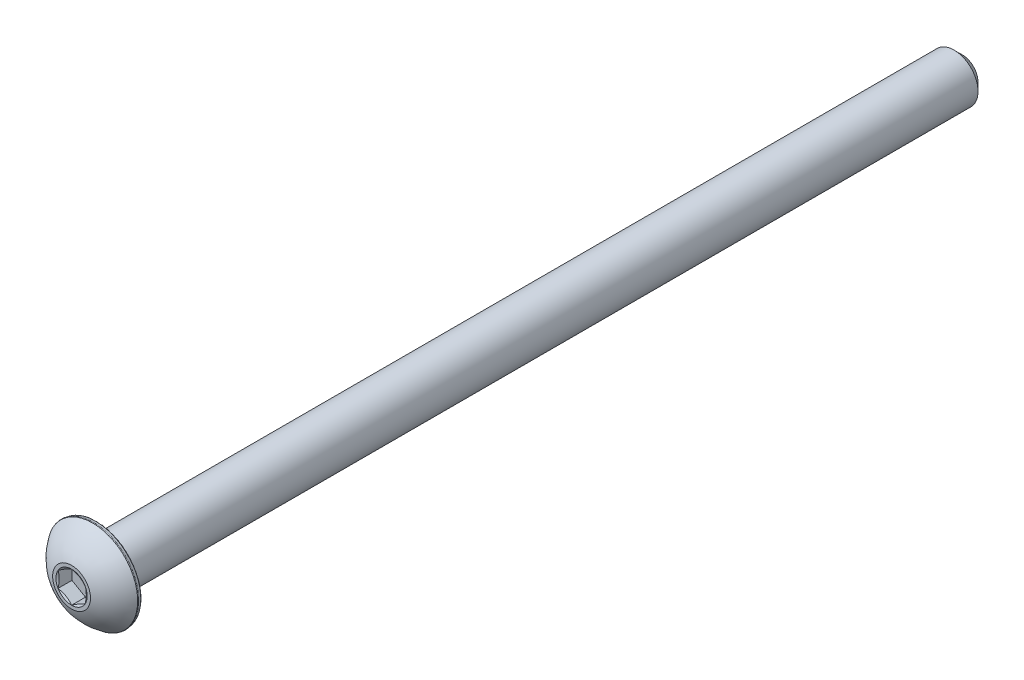
ISO-10303-21;
HEADER;
FILE_DESCRIPTION(('STEP AP214'),'2;1');
FILE_NAME('part.step','',(''),(''),'','','');
FILE_SCHEMA(('AUTOMOTIVE_DESIGN { 1 0 10303 214 1 1 1 1 }'));
ENDSEC;
DATA;
#1=APPLICATION_CONTEXT('core data for automotive mechanical design processes');
#2=APPLICATION_PROTOCOL_DEFINITION('international standard','automotive_design',2000,#1);
#3=PRODUCT_CONTEXT('',#1,'mechanical');
#4=PRODUCT('Part','Part','',(#3));
#5=PRODUCT_RELATED_PRODUCT_CATEGORY('part','',(#4));
#6=PRODUCT_DEFINITION_FORMATION('','',#4);
#7=PRODUCT_DEFINITION_CONTEXT('part definition',#1,'design');
#8=PRODUCT_DEFINITION('design','',#6,#7);
#9=PRODUCT_DEFINITION_SHAPE('','',#8);
#10=(LENGTH_UNIT() NAMED_UNIT(*) SI_UNIT(.MILLI.,.METRE.));
#11=(NAMED_UNIT(*) PLANE_ANGLE_UNIT() SI_UNIT($,.RADIAN.));
#12=(NAMED_UNIT(*) SI_UNIT($,.STERADIAN.) SOLID_ANGLE_UNIT());
#13=UNCERTAINTY_MEASURE_WITH_UNIT(LENGTH_MEASURE(1.E-05),#10,'distance_accuracy_value','');
#14=(GEOMETRIC_REPRESENTATION_CONTEXT(3) GLOBAL_UNCERTAINTY_ASSIGNED_CONTEXT((#13)) GLOBAL_UNIT_ASSIGNED_CONTEXT((#10,
#11,#12)) REPRESENTATION_CONTEXT('',''));
#15=CARTESIAN_POINT('',(0.,0.,0.));
#16=DIRECTION('',(0.,0.,1.));
#17=DIRECTION('',(1.,0.,0.));
#18=AXIS2_PLACEMENT_3D('',#15,#16,#17);
#19=CARTESIAN_POINT('',(0.,0.,32.6771));
#20=DIRECTION('',(0.,0.,-1.));
#21=DIRECTION('',(-1.,0.,0.));
#22=AXIS2_PLACEMENT_3D('',#19,#20,#21);
#23=PLANE('',#22);
#24=CARTESIAN_POINT('',(0.,0.,32.6771));
#25=DIRECTION('',(0.,0.,1.));
#26=DIRECTION('',(1.,0.,0.));
#27=AXIS2_PLACEMENT_3D('',#24,#25,#26);
#28=CIRCLE('',#27,1.14567944042316);
#29=CARTESIAN_POINT('',(-0.9921875,0.572839720211583,32.6771));
#30=VERTEX_POINT('',#29);
#31=CARTESIAN_POINT('',(-0.992187500000003,-0.572839720211579,32.6771));
#32=VERTEX_POINT('',#31);
#33=EDGE_CURVE('E98',#30,#32,#28,.T.);
#34=ORIENTED_EDGE('',*,*,#33,.F.);
#35=CARTESIAN_POINT('',(0.,1.14567944042316,32.6771));
#36=VERTEX_POINT('',#35);
#37=EDGE_CURVE('E108',#36,#30,#28,.T.);
#38=ORIENTED_EDGE('',*,*,#37,.F.);
#39=CARTESIAN_POINT('',(0.9921875,0.572839720211584,32.6771));
#40=VERTEX_POINT('',#39);
#41=EDGE_CURVE('E58',#40,#36,#28,.T.);
#42=ORIENTED_EDGE('',*,*,#41,.F.);
#43=CARTESIAN_POINT('',(0.992187500000003,-0.572839720211579,32.6771));
#44=VERTEX_POINT('',#43);
#45=EDGE_CURVE('E65',#44,#40,#28,.T.);
#46=ORIENTED_EDGE('',*,*,#45,.F.);
#47=CARTESIAN_POINT('',(0.,-1.14567944042317,32.6771));
#48=VERTEX_POINT('',#47);
#49=EDGE_CURVE('E144',#48,#44,#28,.T.);
#50=ORIENTED_EDGE('',*,*,#49,.F.);
#51=EDGE_CURVE('E109',#32,#48,#28,.T.);
#52=ORIENTED_EDGE('',*,*,#51,.F.);
#53=EDGE_LOOP('',(#34,#38,#42,#46,#50,#52));
#54=FACE_BOUND('',#53,.T.);
#55=CARTESIAN_POINT('',(0.,0.,32.6771));
#56=DIRECTION('',(0.,0.,1.));
#57=DIRECTION('',(1.,0.,0.));
#58=AXIS2_PLACEMENT_3D('',#55,#56,#57);
#59=CIRCLE('',#58,1.3890625);
#60=CARTESIAN_POINT('',(0.,1.38906250000001,32.6771));
#61=VERTEX_POINT('',#60);
#62=EDGE_CURVE('E121',#61,#61,#59,.T.);
#63=ORIENTED_EDGE('',*,*,#62,.T.);
#64=EDGE_LOOP('',(#63));
#65=FACE_BOUND('',#64,.T.);
#66=ADVANCED_FACE('F43',(#54,#65),#23,.F.);
#67=CARTESIAN_POINT('',(0.,0.,28.9887826105459));
#68=DIRECTION('',(0.,0.,1.));
#69=DIRECTION('',(0.,1.,0.));
#70=AXIS2_PLACEMENT_3D('',#67,#68,#69);
#71=SPHERICAL_SURFACE('',#70,3.94121552243158);
#72=CARTESIAN_POINT('',(0.,0.,31.1318779838214));
#73=DIRECTION('',(0.,0.,-1.));
#74=DIRECTION('',(-1.,0.,0.));
#75=AXIS2_PLACEMENT_3D('',#72,#73,#74);
#76=CIRCLE('',#75,3.30761575992451);
#77=CARTESIAN_POINT('',(0.,3.3076157599245,31.1318779838214));
#78=VERTEX_POINT('',#77);
#79=EDGE_CURVE('E120',#78,#78,#76,.F.);
#80=CARTESIAN_POINT('',(0.,3.3076157599245,31.1318779838214));
#81=CARTESIAN_POINT('',(0.,3.29342455417094,31.15378050909));
#82=CARTESIAN_POINT('',(0.,3.27901573621224,31.1755420359098));
#83=CARTESIAN_POINT('',(0.,3.24976869562301,31.2187745953984));
#84=CARTESIAN_POINT('',(0.,3.23493047299246,31.2402456280673));
#85=CARTESIAN_POINT('',(0.,3.20483044279796,31.282888702001));
#86=CARTESIAN_POINT('',(0.,3.189568635234,31.3040607432658));
#87=CARTESIAN_POINT('',(0.,3.15862746747383,31.346097485845));
#88=CARTESIAN_POINT('',(0.,3.14294810727763,31.3669621871592));
#89=CARTESIAN_POINT('',(0.,3.11117801916502,31.4083760143445));
#90=CARTESIAN_POINT('',(0.,3.0950872912486,31.4289251402154));
#91=CARTESIAN_POINT('',(0.,3.06250081820394,31.4696997077608));
#92=CARTESIAN_POINT('',(0.,3.04600507307568,31.4899251494353));
#93=CARTESIAN_POINT('',(0.,3.01261507507252,31.5300443669779));
#94=CARTESIAN_POINT('',(0.,2.99572082219761,31.5499381428461));
#95=CARTESIAN_POINT('',(0.,2.9615404756619,31.5893861782085));
#96=CARTESIAN_POINT('',(0.,2.9442543820011,31.6089404377027));
#97=CARTESIAN_POINT('',(0.,2.90929717542219,31.6477017236894));
#98=CARTESIAN_POINT('',(0.,2.89162606250409,31.6669087501817));
#99=CARTESIAN_POINT('',(0.,2.8559057908946,31.7049679905751));
#100=CARTESIAN_POINT('',(0.,2.83785663220322,31.723820204476));
#101=CARTESIAN_POINT('',(0.,2.80138739171335,31.7611623801124));
#102=CARTESIAN_POINT('',(0.,2.78296730991488,31.7796523418477));
#103=CARTESIAN_POINT('',(0.,2.74576349225414,31.8162627165335));
#104=CARTESIAN_POINT('',(0.,2.72697975639188,31.8343831294839));
#105=CARTESIAN_POINT('',(0.,2.68905604315389,31.8702472558138));
#106=CARTESIAN_POINT('',(0.,2.66991606577817,31.8879909691933));
#107=CARTESIAN_POINT('',(0.,2.63128742264583,31.9230946942509));
#108=CARTESIAN_POINT('',(0.,2.61179875688921,31.940454705929));
#109=CARTESIAN_POINT('',(0.,2.57248042772913,31.974784176872));
#110=CARTESIAN_POINT('',(0.,2.55265076432567,31.9917536361369));
#111=CARTESIAN_POINT('',(0.,2.51265826517249,32.0252953056638));
#112=CARTESIAN_POINT('',(0.,2.49249542942278,32.0418675159257));
#113=CARTESIAN_POINT('',(0.,2.45184454235614,32.0746081476218));
#114=CARTESIAN_POINT('',(0.,2.43135649103921,32.090776569056));
#115=CARTESIAN_POINT('',(0.,2.39006325795573,32.1227032426171));
#116=CARTESIAN_POINT('',(0.,2.36925807618917,32.1384614947441));
#117=CARTESIAN_POINT('',(0.,2.32733879247191,32.169561611075));
#118=CARTESIAN_POINT('',(0.,2.3062246905212,32.1849034752789));
#119=CARTESIAN_POINT('',(0.,2.26369589860907,32.2151647614654));
#120=CARTESIAN_POINT('',(0.,2.24228120864764,32.2300841834479));
#121=CARTESIAN_POINT('',(0.,2.19915969150731,32.2594946975999));
#122=CARTESIAN_POINT('',(0.,2.1774528643284,32.2739857897693));
#123=CARTESIAN_POINT('',(0.,2.13375563883137,32.3025339257334));
#124=CARTESIAN_POINT('',(0.,2.11176524051323,32.3165909695282));
#125=CARTESIAN_POINT('',(0.,2.06750955072035,32.3442654614678));
#126=CARTESIAN_POINT('',(0.,2.0452442592456,32.3578829096128));
#127=CARTESIAN_POINT('',(0.,2.00044756960266,32.3846728364549));
#128=CARTESIAN_POINT('',(0.,1.97791617143446,32.3978453151521));
#129=CARTESIAN_POINT('',(0.,1.93259615987838,32.4237401048924));
#130=CARTESIAN_POINT('',(0.,1.90980754649049,32.4364624159355));
#131=CARTESIAN_POINT('',(0.,1.8639820974801,32.4614518498277));
#132=CARTESIAN_POINT('',(0.,1.84094526185761,32.4737189726768));
#133=CARTESIAN_POINT('',(0.,1.79463245928997,32.4977931892002));
#134=CARTESIAN_POINT('',(0.,1.77135649234482,32.5096002828744));
#135=CARTESIAN_POINT('',(0.,1.7245746125161,32.5327497818689));
#136=CARTESIAN_POINT('',(0.,1.70106869963252,32.5440921871892));
#137=CARTESIAN_POINT('',(0.,1.65383620366255,32.5663078326954));
#138=CARTESIAN_POINT('',(0.,1.63010962057617,32.5771810728814));
#139=CARTESIAN_POINT('',(0.,1.58244514847849,32.5984541001383));
#140=CARTESIAN_POINT('',(0.,1.5585072594672,32.6088538872094));
#141=CARTESIAN_POINT('',(0.,1.51042961773539,32.6291758934522));
#142=CARTESIAN_POINT('',(0.,1.48628986501488,32.639098112624));
#143=CARTESIAN_POINT('',(0.,1.43781803807699,32.6584611076524));
#144=CARTESIAN_POINT('',(0.,1.41348596385962,32.667901883509));
#145=CARTESIAN_POINT('',(0.,1.38906250000001,32.6771));
#146=B_SPLINE_CURVE_WITH_KNOTS('',3,(#80,#81,#82,#83,#84,#85,#86,#87,#88,#89,#90,#91,#92,#93,
#94,#95,#96,#97,#98,#99,#100,#101,#102,#103,#104,#105,#106,#107,#108,#109,#110,#111,#112,#113,
#114,#115,#116,#117,#118,#119,#120,#121,#122,#123,#124,#125,#126,#127,#128,#129,#130,#131,#132,
#133,#134,#135,#136,#137,#138,#139,#140,#141,#142,#143,#144,#145),.UNSPECIFIED.,.F.,.F.,(4,2,2,
2,2,2,2,2,2,2,2,2,2,2,2,2,2,2,2,2,2,2,2,2,2,2,2,2,2,2,2,2,4),(0.,0.0782930168067684,
0.156586033613536,0.234879050420303,0.313172067227074,0.391465084033839,0.469758100840609,
0.548051117647374,0.626344134454144,0.704637151260912,0.782930168067678,0.861223184874443,
0.939516201681211,1.01780921848798,1.09610223529475,1.17439525210152,1.25268826890828,
1.33098128571505,1.40927430252182,1.48756731932858,1.56586033613535,1.64415335294212,
1.72244636974889,1.80073938655565,1.87903240336242,1.95732542016919,2.03561843697596,
2.11391145378273,2.1922044705895,2.27049748739626,2.34879050420303,2.4270835210098,
2.50537653781657),.UNSPECIFIED.);
#147=EDGE_CURVE('BSEAM222',#78,#61,#146,.T.);
#148=ORIENTED_EDGE('',*,*,#79,.T.);
#149=ORIENTED_EDGE('',*,*,#62,.F.);
#150=ORIENTED_EDGE('',*,*,#147,.T.);
#151=ORIENTED_EDGE('',*,*,#147,.F.);
#152=EDGE_LOOP('',(#148,#150,#149,#151));
#153=FACE_BOUND('',#152,.T.);
#154=ADVANCED_FACE('F222',(#153),#71,.T.);
#155=CARTESIAN_POINT('',(0.,0.,30.8229));
#156=DIRECTION('',(0.,0.,1.));
#157=DIRECTION('',(1.,0.,0.));
#158=AXIS2_PLACEMENT_3D('',#155,#156,#157);
#159=CONICAL_SURFACE('',#158,3.27835817685556,0.174532925199434);
#160=CARTESIAN_POINT('',(0.,0.,31.0653666007166));
#161=DIRECTION('',(0.,0.,-1.));
#162=DIRECTION('',(-1.,0.,0.));
#163=AXIS2_PLACEMENT_3D('',#160,#161,#162);
#164=CIRCLE('',#163,3.32111158048257);
#165=CARTESIAN_POINT('',(-3.32111158048257,0.,31.0653666007166));
#166=VERTEX_POINT('',#165);
#167=EDGE_CURVE('E52',#166,#166,#164,.T.);
#168=ORIENTED_EDGE('',*,*,#167,.T.);
#169=EDGE_LOOP('',(#168));
#170=FACE_BOUND('',#169,.T.);
#171=CARTESIAN_POINT('',(0.,0.,30.8995110774485));
#172=DIRECTION('',(0.,0.,-1.));
#173=DIRECTION('',(-1.,0.,0.));
#174=AXIS2_PLACEMENT_3D('',#171,#172,#173);
#175=CIRCLE('',#174,3.29186677683088);
#176=CARTESIAN_POINT('',(-3.29186677683088,0.,30.8995110774485));
#177=VERTEX_POINT('',#176);
#178=EDGE_CURVE('E245',#177,#177,#175,.F.);
#179=ORIENTED_EDGE('',*,*,#178,.T.);
#180=EDGE_LOOP('',(#179));
#181=FACE_BOUND('',#180,.T.);
#182=ADVANCED_FACE('F227',(#170,#181),#159,.T.);
#183=CARTESIAN_POINT('',(0.,3.27835817685556,30.8229));
#184=DIRECTION('',(0.,0.,1.));
#185=DIRECTION('',(1.,0.,0.));
#186=AXIS2_PLACEMENT_3D('',#183,#184,#185);
#187=PLANE('',#186);
#188=CARTESIAN_POINT('',(0.,0.,30.8229));
#189=DIRECTION('',(0.,0.,1.));
#190=DIRECTION('',(1.,0.,0.));
#191=AXIS2_PLACEMENT_3D('',#188,#189,#190);
#192=CIRCLE('',#191,3.20056525004911);
#193=CARTESIAN_POINT('',(3.20056525004911,0.,30.8229));
#194=VERTEX_POINT('',#193);
#195=EDGE_CURVE('E11',#194,#194,#192,.F.);
#196=ORIENTED_EDGE('',*,*,#195,.T.);
#197=EDGE_LOOP('',(#196));
#198=FACE_BOUND('',#197,.T.);
#199=CARTESIAN_POINT('',(0.,0.,30.8229));
#200=DIRECTION('',(0.,0.,1.));
#201=DIRECTION('',(1.,0.,0.));
#202=AXIS2_PLACEMENT_3D('',#199,#200,#201);
#203=CIRCLE('',#202,1.75260000000001);
#204=CARTESIAN_POINT('',(1.75260000000001,0.,30.8229));
#205=VERTEX_POINT('',#204);
#206=EDGE_CURVE('E325',#205,#205,#203,.T.);
#207=ORIENTED_EDGE('',*,*,#206,.T.);
#208=EDGE_LOOP('',(#207));
#209=FACE_BOUND('',#208,.T.);
#210=ADVANCED_FACE('F253',(#198,#209),#187,.F.);
#211=CARTESIAN_POINT('',(0.,0.,32.6771));
#212=DIRECTION('',(0.,0.,1.));
#213=DIRECTION('',(1.,0.,0.));
#214=AXIS2_PLACEMENT_3D('',#211,#212,#213);
#215=CYLINDRICAL_SURFACE('',#214,1.75260000000001);
#216=ORIENTED_EDGE('',*,*,#206,.F.);
#217=EDGE_LOOP('',(#216));
#218=FACE_BOUND('',#217,.T.);
#219=CARTESIAN_POINT('',(0.,0.,-32.0817875));
#220=DIRECTION('',(0.,0.,1.));
#221=DIRECTION('',(1.,0.,0.));
#222=AXIS2_PLACEMENT_3D('',#219,#220,#221);
#223=CIRCLE('',#222,1.75260000000001);
#224=CARTESIAN_POINT('',(1.75260000000001,0.,-32.0817875));
#225=VERTEX_POINT('',#224);
#226=EDGE_CURVE('E321',#225,#225,#223,.T.);
#227=ORIENTED_EDGE('',*,*,#226,.T.);
#228=EDGE_LOOP('',(#227));
#229=FACE_BOUND('',#228,.T.);
#230=ADVANCED_FACE('F259',(#218,#229),#215,.T.);
#231=CARTESIAN_POINT('',(0.,0.,-32.6771));
#232=DIRECTION('',(0.,0.,1.));
#233=DIRECTION('',(1.,0.,0.));
#234=AXIS2_PLACEMENT_3D('',#231,#232,#233);
#235=CONICAL_SURFACE('',#234,1.15728750000001,0.785398163397448);
#236=ORIENTED_EDGE('',*,*,#226,.F.);
#237=EDGE_LOOP('',(#236));
#238=FACE_BOUND('',#237,.T.);
#239=CARTESIAN_POINT('',(0.,0.,-32.6771));
#240=DIRECTION('',(0.,0.,1.));
#241=DIRECTION('',(1.,0.,0.));
#242=AXIS2_PLACEMENT_3D('',#239,#240,#241);
#243=CIRCLE('',#242,1.15728750000001);
#244=CARTESIAN_POINT('',(1.15728750000001,0.,-32.6771));
#245=VERTEX_POINT('',#244);
#246=EDGE_CURVE('E304',#245,#245,#243,.T.);
#247=ORIENTED_EDGE('',*,*,#246,.T.);
#248=EDGE_LOOP('',(#247));
#249=FACE_BOUND('',#248,.T.);
#250=ADVANCED_FACE('F265',(#238,#249),#235,.T.);
#251=CARTESIAN_POINT('',(0.,0.,-32.6771));
#252=DIRECTION('',(0.,0.,1.));
#253=DIRECTION('',(1.,0.,0.));
#254=AXIS2_PLACEMENT_3D('',#251,#252,#253);
#255=PLANE('',#254);
#256=ORIENTED_EDGE('',*,*,#246,.F.);
#257=EDGE_LOOP('',(#256));
#258=FACE_BOUND('',#257,.T.);
#259=ADVANCED_FACE('F269',(#258),#255,.F.);
#260=CARTESIAN_POINT('',(0.,0.,32.6771));
#261=DIRECTION('',(0.,0.,1.));
#262=DIRECTION('',(1.,0.,0.));
#263=AXIS2_PLACEMENT_3D('',#260,#261,#262);
#264=CONICAL_SURFACE('',#263,1.14567944042316,1.0471975511966);
#265=ORIENTED_EDGE('',*,*,#51,.T.);
#266=CARTESIAN_POINT('',(-0.9923875,-0.572724250157743,32.6771666767444));
#267=CARTESIAN_POINT('',(-0.948783492658109,-0.59789903553433,32.6626234442558));
#268=CARTESIAN_POINT('',(-0.904803103628137,-0.623291124979849,32.649396299182));
#269=CARTESIAN_POINT('',(-0.816080559479615,-0.674515109727186,32.6263067952555));
#270=CARTESIAN_POINT('',(-0.771336826407994,-0.700347916060636,32.6164526070224));
#271=CARTESIAN_POINT('',(-0.682403948333445,-0.751693337156785,32.6011112263757));
#272=CARTESIAN_POINT('',(-0.638228496705448,-0.777198046045782,32.5955219611989));
#273=CARTESIAN_POINT('',(-0.549669445096506,-0.828327638331382,32.588846252907));
#274=CARTESIAN_POINT('',(-0.50528616758769,-0.853952335548615,32.58775428521));
#275=CARTESIAN_POINT('',(-0.422334414499643,-0.90184455252375,32.5900107308994));
#276=CARTESIAN_POINT('',(-0.383753600489384,-0.924119195878128,32.5928051057454));
#277=CARTESIAN_POINT('',(-0.306843358672617,-0.968523344694478,32.6016663670157));
#278=CARTESIAN_POINT('',(-0.268514197423255,-0.990652696259609,32.6077362883852));
#279=CARTESIAN_POINT('',(-0.191445032493357,-1.03514859937811,32.6229124841969));
#280=CARTESIAN_POINT('',(-0.152714796666076,-1.05750951145876,32.6320831707724));
#281=CARTESIAN_POINT('',(-0.0758323959413359,-1.10189758621314,32.6528977373607));
#282=CARTESIAN_POINT('',(-0.0376792439873593,-1.1239253187642,32.6645367180526));
#283=CARTESIAN_POINT('',(0.000200000000000351,-1.145794910477,32.6771666767444));
#284=B_SPLINE_CURVE_WITH_KNOTS('',3,(#266,#267,#268,#269,#270,#271,#272,#273,#274,#275,#276,
#277,#278,#279,#280,#281,#282,#283),.UNSPECIFIED.,.F.,.F.,(4,2,2,2,2,2,2,2,4),(0.,
0.157285476252497,0.314949306777112,0.468709903890828,0.622281561568946,0.756064601398105,
0.889971810762988,1.02685159539063,1.16346218837027),.UNSPECIFIED.);
#285=EDGE_CURVE('E114',#32,#48,#284,.T.);
#286=ORIENTED_EDGE('',*,*,#285,.F.);
#287=EDGE_LOOP('',(#265,#286));
#288=FACE_BOUND('',#287,.T.);
#289=ADVANCED_FACE('F115',(#288),#264,.F.);
#290=ORIENTED_EDGE('',*,*,#49,.T.);
#291=CARTESIAN_POINT('',(-0.000199999999999468,-1.145794910477,32.6771666767444));
#292=CARTESIAN_POINT('',(0.0434040073418915,-1.12062012510041,32.6626234442558));
#293=CARTESIAN_POINT('',(0.0873843963718626,-1.09522803565489,32.649396299182));
#294=CARTESIAN_POINT('',(0.176106940520384,-1.04400405090756,32.6263067952555));
#295=CARTESIAN_POINT('',(0.220850673592006,-1.01817124457411,32.6164526070224));
#296=CARTESIAN_POINT('',(0.309783551666555,-0.966825823477959,32.6011112263757));
#297=CARTESIAN_POINT('',(0.353959003294552,-0.941321114588962,32.5955219611989));
#298=CARTESIAN_POINT('',(0.442518054903492,-0.890191522303362,32.588846252907));
#299=CARTESIAN_POINT('',(0.486901332412309,-0.864566825086129,32.58775428521));
#300=CARTESIAN_POINT('',(0.569853085500355,-0.816674608110994,32.5900107308994));
#301=CARTESIAN_POINT('',(0.608433899510615,-0.794399964756616,32.5928051057454));
#302=CARTESIAN_POINT('',(0.685344141327382,-0.749995815940266,32.6016663670157));
#303=CARTESIAN_POINT('',(0.723673302576744,-0.727866464375134,32.6077362883852));
#304=CARTESIAN_POINT('',(0.800742467506642,-0.683370561256638,32.6229124841969));
#305=CARTESIAN_POINT('',(0.839472703333923,-0.661009649175979,32.6320831707724));
#306=CARTESIAN_POINT('',(0.916355104058663,-0.616621574421606,32.6528977373607));
#307=CARTESIAN_POINT('',(0.95450825601264,-0.594593841870545,32.6645367180526));
#308=CARTESIAN_POINT('',(0.9923875,-0.572724250157743,32.6771666767444));
#309=B_SPLINE_CURVE_WITH_KNOTS('',3,(#291,#292,#293,#294,#295,#296,#297,#298,#299,#300,#301,
#302,#303,#304,#305,#306,#307,#308),.UNSPECIFIED.,.F.,.F.,(4,2,2,2,2,2,2,2,4),(0.,
0.157285476252497,0.31494930677711,0.468709903890827,0.622281561568944,0.756064601398103,
0.889971810762987,1.02685159539063,1.16346218837027),.UNSPECIFIED.);
#310=EDGE_CURVE('E149',#48,#44,#309,.T.);
#311=ORIENTED_EDGE('',*,*,#310,.F.);
#312=EDGE_LOOP('',(#290,#311));
#313=FACE_BOUND('',#312,.T.);
#314=ADVANCED_FACE('F356',(#313),#264,.F.);
#315=ORIENTED_EDGE('',*,*,#45,.T.);
#316=CARTESIAN_POINT('',(0.9921875,-1.48346430017253,33.0460303255462));
#317=CARTESIAN_POINT('',(0.9921875,-1.44061781379524,33.0254719346909));
#318=CARTESIAN_POINT('',(0.9921875,-1.39766756759392,33.0051307530292));
#319=CARTESIAN_POINT('',(0.9921875,-1.31150268631536,32.9649965316903));
#320=CARTESIAN_POINT('',(0.9921875,-1.26828800534352,32.94520359066));
#321=CARTESIAN_POINT('',(0.9921875,-1.1376654035593,32.8865955832954));
#322=CARTESIAN_POINT('',(0.9921875,-1.04979116923791,32.8488005536465));
#323=CARTESIAN_POINT('',(0.9921875,-0.869982745280389,32.7765626502056));
#324=CARTESIAN_POINT('',(0.9921875,-0.778002448480641,32.7422329823099));
#325=CARTESIAN_POINT('',(0.9921875,-0.591672904739911,32.6811416497979));
#326=CARTESIAN_POINT('',(0.9921875,-0.497330517205337,32.6543603373075));
#327=CARTESIAN_POINT('',(0.9921875,-0.353913267808738,32.6232993968317));
#328=CARTESIAN_POINT('',(0.9921875,-0.305836005647329,32.6144682618397));
#329=CARTESIAN_POINT('',(0.9921875,-0.209142082644046,32.6004460065089));
#330=CARTESIAN_POINT('',(0.9921875,-0.160525458478951,32.5952546401874));
#331=CARTESIAN_POINT('',(0.9921875,-0.0636052204906781,32.5889927389429));
#332=CARTESIAN_POINT('',(0.9921875,-0.0153048356116273,32.5878735752845));
#333=CARTESIAN_POINT('',(0.9921875,0.0812158614306205,32.5897210019121));
#334=CARTESIAN_POINT('',(0.9921875,0.129436168450578,32.5926878451899));
#335=CARTESIAN_POINT('',(0.9921875,0.248413577179174,32.6047877098392));
#336=CARTESIAN_POINT('',(0.9921875,0.318940575965639,32.6161881815971));
#337=CARTESIAN_POINT('',(0.9921875,0.45861787406522,32.6455884399035));
#338=CARTESIAN_POINT('',(0.9921875,0.527766407778373,32.6635961802141));
#339=CARTESIAN_POINT('',(0.9921875,0.666170294342291,32.7047519904533));
#340=CARTESIAN_POINT('',(0.9921875,0.735393231472069,32.7280063310331));
#341=CARTESIAN_POINT('',(0.9921875,0.872567707496046,32.7778710156708));
#342=CARTESIAN_POINT('',(0.9921875,0.940519683120736,32.8044801816697));
#343=CARTESIAN_POINT('',(0.9921875,1.11337840938733,32.8755909981127));
#344=CARTESIAN_POINT('',(0.9921875,1.21759837035788,32.9217459672636));
#345=CARTESIAN_POINT('',(0.9921875,1.42454284522826,33.0172982135949));
#346=CARTESIAN_POINT('',(0.9921875,1.52726696720339,33.0666963224776));
#347=CARTESIAN_POINT('',(0.9921875,1.73183062579127,33.1675744728442));
#348=CARTESIAN_POINT('',(0.9921875,1.83366900986381,33.2190568421931));
#349=CARTESIAN_POINT('',(0.9921875,2.0366639470767,33.3233498345964));
#350=CARTESIAN_POINT('',(0.9921875,2.13782047756436,33.3761605015066));
#351=CARTESIAN_POINT('',(0.9921875,2.33011825888518,33.4776633301697));
#352=CARTESIAN_POINT('',(0.9921875,2.42130297685987,33.5262733205809));
#353=CARTESIAN_POINT('',(0.9921875,2.60337907954476,33.6240469318781));
#354=CARTESIAN_POINT('',(0.9921875,2.69427045323815,33.6732105732526));
#355=CARTESIAN_POINT('',(0.9921875,2.87559632366782,33.7718272944081));
#356=CARTESIAN_POINT('',(0.9921875,2.96603139445847,33.8212793199225));
#357=CARTESIAN_POINT('',(0.9921875,3.1467186987446,33.9205052302388));
#358=CARTESIAN_POINT('',(0.9921875,3.23697094156077,33.9702790980616));
#359=CARTESIAN_POINT('',(0.9921875,3.32715749601776,34.0201709579188));
#360=B_SPLINE_CURVE_WITH_KNOTS('',3,(#316,#317,#318,#319,#320,#321,#322,#323,#324,#325,#326,
#327,#328,#329,#330,#331,#332,#333,#334,#335,#336,#337,#338,#339,#340,#341,#342,#343,#344,#345,
#346,#347,#348,#349,#350,#351,#352,#353,#354,#355,#356,#357,#358,#359),.UNSPECIFIED.,.F.,.F.,(4,
2,2,2,2,2,2,2,2,2,2,2,2,2,2,2,2,2,2,2,2,4),(0.,0.14256776104278,0.285161010315826,
0.572055955347284,0.866437149211682,1.16004485851572,1.30657539309774,1.45309602389932,
1.59786110868254,1.74263515723342,1.95651966660498,2.17066249724049,2.38961017481525,
2.60848118115061,2.95031964853992,3.29224612535336,3.63456563896213,3.97689646967437,
4.28689119497033,4.59689742999247,4.9061151519738,5.21531669175159),.UNSPECIFIED.);
#361=EDGE_CURVE('E159',#44,#40,#360,.T.);
#362=ORIENTED_EDGE('',*,*,#361,.F.);
#363=EDGE_LOOP('',(#315,#362));
#364=FACE_BOUND('',#363,.T.);
#365=ADVANCED_FACE('F352',(#364),#264,.F.);
#366=ORIENTED_EDGE('',*,*,#41,.T.);
#367=CARTESIAN_POINT('',(0.9923875,0.572724250157746,32.6771666767444));
#368=CARTESIAN_POINT('',(0.948783492658108,0.597899035534334,32.6626234442558));
#369=CARTESIAN_POINT('',(0.904803103628137,0.623291124979852,32.649396299182));
#370=CARTESIAN_POINT('',(0.816080559479615,0.674515109727189,32.6263067952555));
#371=CARTESIAN_POINT('',(0.771336826407994,0.700347916060638,32.6164526070224));
#372=CARTESIAN_POINT('',(0.682403948333445,0.751693337156787,32.6011112263757));
#373=CARTESIAN_POINT('',(0.638228496705448,0.777198046045784,32.5955219611989));
#374=CARTESIAN_POINT('',(0.549669445096507,0.828327638331384,32.588846252907));
#375=CARTESIAN_POINT('',(0.505286167587691,0.853952335548617,32.58775428521));
#376=CARTESIAN_POINT('',(0.422334414499644,0.901844552523753,32.5900107308995));
#377=CARTESIAN_POINT('',(0.383753600489384,0.924119195878131,32.5928051057454));
#378=CARTESIAN_POINT('',(0.306843358672616,0.968523344694481,32.6016663670157));
#379=CARTESIAN_POINT('',(0.268514197423255,0.990652696259612,32.6077362883852));
#380=CARTESIAN_POINT('',(0.191445032493357,1.03514859937811,32.6229124841969));
#381=CARTESIAN_POINT('',(0.152714796666076,1.05750951145877,32.6320831707724));
#382=CARTESIAN_POINT('',(0.0758323959413361,1.10189758621314,32.6528977373607));
#383=CARTESIAN_POINT('',(0.0376792439873594,1.1239253187642,32.6645367180526));
#384=CARTESIAN_POINT('',(-0.000200000000000306,1.145794910477,32.6771666767444));
#385=B_SPLINE_CURVE_WITH_KNOTS('',3,(#367,#368,#369,#370,#371,#372,#373,#374,#375,#376,#377,
#378,#379,#380,#381,#382,#383,#384),.UNSPECIFIED.,.F.,.F.,(4,2,2,2,2,2,2,2,4),(0.,
0.157285476252496,0.314949306777111,0.468709903890827,0.622281561568944,0.756064601398105,
0.889971810762987,1.02685159539063,1.16346218837027),.UNSPECIFIED.);
#386=EDGE_CURVE('E186',#40,#36,#385,.T.);
#387=ORIENTED_EDGE('',*,*,#386,.F.);
#388=EDGE_LOOP('',(#366,#387));
#389=FACE_BOUND('',#388,.T.);
#390=ADVANCED_FACE('F348',(#389),#264,.F.);
#391=ORIENTED_EDGE('',*,*,#37,.T.);
#392=CARTESIAN_POINT('',(0.00019999999999906,1.145794910477,32.6771666767444));
#393=CARTESIAN_POINT('',(-0.0434040073418933,1.12062012510041,32.6626234442558));
#394=CARTESIAN_POINT('',(-0.0873843963718643,1.0952280356549,32.649396299182));
#395=CARTESIAN_POINT('',(-0.176106940520386,1.04400405090756,32.6263067952555));
#396=CARTESIAN_POINT('',(-0.220850673592007,1.01817124457411,32.6164526070224));
#397=CARTESIAN_POINT('',(-0.309783551666556,0.966825823477961,32.6011112263757));
#398=CARTESIAN_POINT('',(-0.353959003294553,0.941321114588964,32.5955219611989));
#399=CARTESIAN_POINT('',(-0.442518054903494,0.890191522303363,32.588846252907));
#400=CARTESIAN_POINT('',(-0.48690133241231,0.864566825086131,32.58775428521));
#401=CARTESIAN_POINT('',(-0.569853085500357,0.816674608110995,32.5900107308995));
#402=CARTESIAN_POINT('',(-0.608433899510617,0.794399964756617,32.5928051057454));
#403=CARTESIAN_POINT('',(-0.685344141327384,0.749995815940267,32.6016663670157));
#404=CARTESIAN_POINT('',(-0.723673302576745,0.727866464375136,32.6077362883852));
#405=CARTESIAN_POINT('',(-0.800742467506643,0.68337056125664,32.6229124841969));
#406=CARTESIAN_POINT('',(-0.839472703333924,0.661009649175981,32.6320831707724));
#407=CARTESIAN_POINT('',(-0.916355104058663,0.616621574421608,32.6528977373607));
#408=CARTESIAN_POINT('',(-0.95450825601264,0.594593841870547,32.6645367180526));
#409=CARTESIAN_POINT('',(-0.9923875,0.572724250157745,32.6771666767444));
#410=B_SPLINE_CURVE_WITH_KNOTS('',3,(#392,#393,#394,#395,#396,#397,#398,#399,#400,#401,#402,
#403,#404,#405,#406,#407,#408,#409),.UNSPECIFIED.,.F.,.F.,(4,2,2,2,2,2,2,2,4),(0.,
0.157285476252496,0.314949306777111,0.468709903890828,0.622281561568944,0.756064601398105,
0.889971810762987,1.02685159539063,1.16346218837026),.UNSPECIFIED.);
#411=EDGE_CURVE('E132',#36,#30,#410,.T.);
#412=ORIENTED_EDGE('',*,*,#411,.F.);
#413=EDGE_LOOP('',(#391,#412));
#414=FACE_BOUND('',#413,.T.);
#415=ADVANCED_FACE('F173',(#414),#264,.F.);
#416=ORIENTED_EDGE('',*,*,#33,.T.);
#417=CARTESIAN_POINT('',(-0.9921875,-1.48346430017253,33.0460303255462));
#418=CARTESIAN_POINT('',(-0.9921875,-1.44061781379524,33.0254719346909));
#419=CARTESIAN_POINT('',(-0.9921875,-1.39766756759392,33.0051307530292));
#420=CARTESIAN_POINT('',(-0.9921875,-1.31150268631536,32.9649965316903));
#421=CARTESIAN_POINT('',(-0.9921875,-1.26828800534352,32.94520359066));
#422=CARTESIAN_POINT('',(-0.9921875,-1.1376654035593,32.8865955832954));
#423=CARTESIAN_POINT('',(-0.9921875,-1.04979116923791,32.8488005536465));
#424=CARTESIAN_POINT('',(-0.9921875,-0.869982745280388,32.7765626502056));
#425=CARTESIAN_POINT('',(-0.9921875,-0.77800244848064,32.7422329823099));
#426=CARTESIAN_POINT('',(-0.9921875,-0.59167290473991,32.6811416497979));
#427=CARTESIAN_POINT('',(-0.9921875,-0.497330517205336,32.6543603373075));
#428=CARTESIAN_POINT('',(-0.9921875,-0.353913267808738,32.6232993968317));
#429=CARTESIAN_POINT('',(-0.9921875,-0.305836005647329,32.6144682618397));
#430=CARTESIAN_POINT('',(-0.9921875,-0.209142082644046,32.6004460065089));
#431=CARTESIAN_POINT('',(-0.9921875,-0.160525458478951,32.5952546401874));
#432=CARTESIAN_POINT('',(-0.9921875,-0.063605220490678,32.5889927389429));
#433=CARTESIAN_POINT('',(-0.9921875,-0.0153048356116273,32.5878735752845));
#434=CARTESIAN_POINT('',(-0.9921875,0.0812158614306203,32.5897210019121));
#435=CARTESIAN_POINT('',(-0.9921875,0.129436168450578,32.5926878451899));
#436=CARTESIAN_POINT('',(-0.9921875,0.248413577179173,32.6047877098392));
#437=CARTESIAN_POINT('',(-0.9921875,0.318940575965637,32.6161881815971));
#438=CARTESIAN_POINT('',(-0.9921875,0.458617874065218,32.6455884399035));
#439=CARTESIAN_POINT('',(-0.9921875,0.527766407778372,32.6635961802141));
#440=CARTESIAN_POINT('',(-0.9921875,0.666170294342291,32.7047519904533));
#441=CARTESIAN_POINT('',(-0.9921875,0.735393231472069,32.7280063310331));
#442=CARTESIAN_POINT('',(-0.9921875,0.872567707496046,32.7778710156708));
#443=CARTESIAN_POINT('',(-0.9921875,0.940519683120736,32.8044801816697));
#444=CARTESIAN_POINT('',(-0.9921875,1.11337840938733,32.8755909981127));
#445=CARTESIAN_POINT('',(-0.9921875,1.21759837035788,32.9217459672636));
#446=CARTESIAN_POINT('',(-0.9921875,1.42454284522826,33.0172982135949));
#447=CARTESIAN_POINT('',(-0.9921875,1.52726696720339,33.0666963224776));
#448=CARTESIAN_POINT('',(-0.9921875,1.73183062579127,33.1675744728442));
#449=CARTESIAN_POINT('',(-0.9921875,1.83366900986382,33.2190568421931));
#450=CARTESIAN_POINT('',(-0.9921875,2.0366639470767,33.3233498345964));
#451=CARTESIAN_POINT('',(-0.9921875,2.13782047756436,33.3761605015066));
#452=CARTESIAN_POINT('',(-0.9921875,2.33011825888518,33.4776633301697));
#453=CARTESIAN_POINT('',(-0.992187500000001,2.42130297685987,33.5262733205809));
#454=CARTESIAN_POINT('',(-0.992187500000001,2.60337907954476,33.6240469318781));
#455=CARTESIAN_POINT('',(-0.992187500000001,2.69427045323815,33.6732105732526));
#456=CARTESIAN_POINT('',(-0.992187500000001,2.87559632366782,33.7718272944081));
#457=CARTESIAN_POINT('',(-0.992187500000001,2.96603139445847,33.8212793199225));
#458=CARTESIAN_POINT('',(-0.992187500000001,3.1467186987446,33.9205052302388));
#459=CARTESIAN_POINT('',(-0.992187500000001,3.23697094156077,33.9702790980616));
#460=CARTESIAN_POINT('',(-0.992187500000001,3.32715749601776,34.0201709579188));
#461=B_SPLINE_CURVE_WITH_KNOTS('',3,(#417,#418,#419,#420,#421,#422,#423,#424,#425,#426,#427,
#428,#429,#430,#431,#432,#433,#434,#435,#436,#437,#438,#439,#440,#441,#442,#443,#444,#445,#446,
#447,#448,#449,#450,#451,#452,#453,#454,#455,#456,#457,#458,#459,#460),.UNSPECIFIED.,.F.,.F.,(4,
2,2,2,2,2,2,2,2,2,2,2,2,2,2,2,2,2,2,2,2,4),(0.,0.14256776104278,0.285161010315825,
0.572055955347284,0.866437149211683,1.16004485851572,1.30657539309774,1.45309602389932,
1.59786110868254,1.74263515723342,1.95651966660498,2.17066249724049,2.38961017481525,
2.60848118115061,2.95031964853992,3.29224612535336,3.63456563896213,3.97689646967437,
4.28689119497033,4.59689742999246,4.9061151519738,5.21531669175159),.UNSPECIFIED.);
#462=EDGE_CURVE('E102',#30,#32,#461,.F.);
#463=ORIENTED_EDGE('',*,*,#462,.F.);
#464=EDGE_LOOP('',(#416,#463));
#465=FACE_BOUND('',#464,.T.);
#466=ADVANCED_FACE('F100',(#465),#264,.F.);
#467=CARTESIAN_POINT('',(0.,0.,31.65729));
#468=DIRECTION('',(0.,0.,1.));
#469=DIRECTION('',(1.,0.,0.));
#470=AXIS2_PLACEMENT_3D('',#467,#468,#469);
#471=PLANE('',#470);
#472=DIRECTION('',(0.,-1.,0.));
#473=VECTOR('',#472,1.);
#474=CARTESIAN_POINT('',(-0.9921875,0.572839720211583,31.65729));
#475=LINE('',#474,#473);
#476=CARTESIAN_POINT('',(-0.9921875,0.572839720211583,31.65729));
#477=VERTEX_POINT('',#476);
#478=CARTESIAN_POINT('',(-0.9921875,-0.572839720211581,31.65729));
#479=VERTEX_POINT('',#478);
#480=EDGE_CURVE('E131',#477,#479,#475,.T.);
#481=ORIENTED_EDGE('',*,*,#480,.T.);
#482=DIRECTION('',(0.866025403784439,-0.5,0.));
#483=VECTOR('',#482,1.);
#484=CARTESIAN_POINT('',(-0.9921875,-0.572839720211581,31.65729));
#485=LINE('',#484,#483);
#486=CARTESIAN_POINT('',(0.,-1.14567944042316,31.65729));
#487=VERTEX_POINT('',#486);
#488=EDGE_CURVE('E136',#479,#487,#485,.T.);
#489=ORIENTED_EDGE('',*,*,#488,.T.);
#490=DIRECTION('',(0.866025403784438,0.5,0.));
#491=VECTOR('',#490,1.);
#492=CARTESIAN_POINT('',(0.,-1.14567944042316,31.65729));
#493=LINE('',#492,#491);
#494=CARTESIAN_POINT('',(0.9921875,-0.572839720211581,31.65729));
#495=VERTEX_POINT('',#494);
#496=EDGE_CURVE('E288',#487,#495,#493,.T.);
#497=ORIENTED_EDGE('',*,*,#496,.T.);
#498=DIRECTION('',(0.,1.,0.));
#499=VECTOR('',#498,1.);
#500=CARTESIAN_POINT('',(0.9921875,-0.572839720211581,31.65729));
#501=LINE('',#500,#499);
#502=CARTESIAN_POINT('',(0.9921875,0.572839720211583,31.65729));
#503=VERTEX_POINT('',#502);
#504=EDGE_CURVE('E293',#495,#503,#501,.T.);
#505=ORIENTED_EDGE('',*,*,#504,.T.);
#506=DIRECTION('',(-0.866025403784439,0.5,0.));
#507=VECTOR('',#506,1.);
#508=CARTESIAN_POINT('',(0.9921875,0.572839720211583,31.65729));
#509=LINE('',#508,#507);
#510=CARTESIAN_POINT('',(0.,1.14567944042317,31.65729));
#511=VERTEX_POINT('',#510);
#512=EDGE_CURVE('E297',#503,#511,#509,.T.);
#513=ORIENTED_EDGE('',*,*,#512,.T.);
#514=DIRECTION('',(-0.866025403784438,-0.5,0.));
#515=VECTOR('',#514,1.);
#516=CARTESIAN_POINT('',(0.,1.14567944042317,31.65729));
#517=LINE('',#516,#515);
#518=EDGE_CURVE('E140',#511,#477,#517,.T.);
#519=ORIENTED_EDGE('',*,*,#518,.T.);
#520=EDGE_LOOP('',(#481,#489,#497,#505,#513,#519));
#521=FACE_BOUND('',#520,.T.);
#522=ADVANCED_FACE('F172',(#521),#471,.T.);
#523=CARTESIAN_POINT('',(-0.9921875,-0.572839720211581,31.65729));
#524=DIRECTION('',(-0.5,-0.866025403784439,0.));
#525=DIRECTION('',(0.866025403784439,-0.5,0.));
#526=AXIS2_PLACEMENT_3D('',#523,#524,#525);
#527=PLANE('',#526);
#528=DIRECTION('',(0.,0.,1.));
#529=VECTOR('',#528,1.);
#530=CARTESIAN_POINT('',(-0.9921875,-0.572839720211581,31.65729));
#531=LINE('',#530,#529);
#532=EDGE_CURVE('E126',#479,#32,#531,.T.);
#533=ORIENTED_EDGE('',*,*,#532,.T.);
#534=ORIENTED_EDGE('',*,*,#285,.T.);
#535=DIRECTION('',(0.,0.,1.));
#536=VECTOR('',#535,1.);
#537=CARTESIAN_POINT('',(0.,-1.14567944042316,31.65729));
#538=LINE('',#537,#536);
#539=EDGE_CURVE('E139',#487,#48,#538,.T.);
#540=ORIENTED_EDGE('',*,*,#539,.F.);
#541=ORIENTED_EDGE('',*,*,#488,.F.);
#542=EDGE_LOOP('',(#533,#534,#540,#541));
#543=FACE_BOUND('',#542,.T.);
#544=ADVANCED_FACE('F134',(#543),#527,.F.);
#545=CARTESIAN_POINT('',(0.,-1.14567944042316,31.65729));
#546=DIRECTION('',(0.5,-0.866025403784438,0.));
#547=DIRECTION('',(0.866025403784439,0.5,0.));
#548=AXIS2_PLACEMENT_3D('',#545,#546,#547);
#549=PLANE('',#548);
#550=ORIENTED_EDGE('',*,*,#539,.T.);
#551=ORIENTED_EDGE('',*,*,#310,.T.);
#552=DIRECTION('',(0.,0.,1.));
#553=VECTOR('',#552,1.);
#554=CARTESIAN_POINT('',(0.9921875,-0.572839720211581,31.65729));
#555=LINE('',#554,#553);
#556=EDGE_CURVE('E313',#495,#44,#555,.T.);
#557=ORIENTED_EDGE('',*,*,#556,.F.);
#558=ORIENTED_EDGE('',*,*,#496,.F.);
#559=EDGE_LOOP('',(#550,#551,#557,#558));
#560=FACE_BOUND('',#559,.T.);
#561=ADVANCED_FACE('F166',(#560),#549,.F.);
#562=CARTESIAN_POINT('',(0.9921875,-0.572839720211581,31.65729));
#563=DIRECTION('',(1.,0.,0.));
#564=DIRECTION('',(0.,0.,-1.));
#565=AXIS2_PLACEMENT_3D('',#562,#563,#564);
#566=PLANE('',#565);
#567=ORIENTED_EDGE('',*,*,#556,.T.);
#568=ORIENTED_EDGE('',*,*,#361,.T.);
#569=DIRECTION('',(0.,0.,1.));
#570=VECTOR('',#569,1.);
#571=CARTESIAN_POINT('',(0.9921875,0.572839720211583,31.65729));
#572=LINE('',#571,#570);
#573=EDGE_CURVE('E309',#503,#40,#572,.T.);
#574=ORIENTED_EDGE('',*,*,#573,.F.);
#575=ORIENTED_EDGE('',*,*,#504,.F.);
#576=EDGE_LOOP('',(#567,#568,#574,#575));
#577=FACE_BOUND('',#576,.T.);
#578=ADVANCED_FACE('F211',(#577),#566,.F.);
#579=CARTESIAN_POINT('',(0.9921875,0.572839720211583,31.65729));
#580=DIRECTION('',(0.5,0.866025403784439,0.));
#581=DIRECTION('',(-0.866025403784439,0.5,0.));
#582=AXIS2_PLACEMENT_3D('',#579,#580,#581);
#583=PLANE('',#582);
#584=ORIENTED_EDGE('',*,*,#573,.T.);
#585=ORIENTED_EDGE('',*,*,#386,.T.);
#586=DIRECTION('',(0.,0.,1.));
#587=VECTOR('',#586,1.);
#588=CARTESIAN_POINT('',(0.,1.14567944042317,31.65729));
#589=LINE('',#588,#587);
#590=EDGE_CURVE('E305',#511,#36,#589,.T.);
#591=ORIENTED_EDGE('',*,*,#590,.F.);
#592=ORIENTED_EDGE('',*,*,#512,.F.);
#593=EDGE_LOOP('',(#584,#585,#591,#592));
#594=FACE_BOUND('',#593,.T.);
#595=ADVANCED_FACE('F207',(#594),#583,.F.);
#596=CARTESIAN_POINT('',(0.,1.14567944042317,31.65729));
#597=DIRECTION('',(-0.5,0.866025403784438,0.));
#598=DIRECTION('',(-0.866025403784439,-0.5,0.));
#599=AXIS2_PLACEMENT_3D('',#596,#597,#598);
#600=PLANE('',#599);
#601=ORIENTED_EDGE('',*,*,#590,.T.);
#602=ORIENTED_EDGE('',*,*,#411,.T.);
#603=DIRECTION('',(0.,0.,1.));
#604=VECTOR('',#603,1.);
#605=CARTESIAN_POINT('',(-0.9921875,0.572839720211583,31.65729));
#606=LINE('',#605,#604);
#607=EDGE_CURVE('E128',#477,#30,#606,.T.);
#608=ORIENTED_EDGE('',*,*,#607,.F.);
#609=ORIENTED_EDGE('',*,*,#518,.F.);
#610=EDGE_LOOP('',(#601,#602,#608,#609));
#611=FACE_BOUND('',#610,.T.);
#612=ADVANCED_FACE('F204',(#611),#600,.F.);
#613=CARTESIAN_POINT('',(-0.9921875,0.572839720211583,31.65729));
#614=DIRECTION('',(-1.,0.,0.));
#615=DIRECTION('',(0.,-1.,0.));
#616=AXIS2_PLACEMENT_3D('',#613,#614,#615);
#617=PLANE('',#616);
#618=ORIENTED_EDGE('',*,*,#607,.T.);
#619=ORIENTED_EDGE('',*,*,#462,.T.);
#620=ORIENTED_EDGE('',*,*,#532,.F.);
#621=ORIENTED_EDGE('',*,*,#480,.F.);
#622=EDGE_LOOP('',(#618,#619,#620,#621));
#623=FACE_BOUND('',#622,.T.);
#624=ADVANCED_FACE('F124',(#623),#617,.F.);
#625=CARTESIAN_POINT('',(0.,0.,31.0814655232681));
#626=DIRECTION('',(0.,0.,-1.));
#627=DIRECTION('',(-1.,0.,0.));
#628=AXIS2_PLACEMENT_3D('',#625,#626,#627);
#629=TOROIDAL_SURFACE('',#628,3.22981005370081,0.09271);
#630=ORIENTED_EDGE('',*,*,#167,.F.);
#631=EDGE_LOOP('',(#630));
#632=FACE_BOUND('',#631,.T.);
#633=ORIENTED_EDGE('',*,*,#79,.F.);
#634=EDGE_LOOP('',(#633));
#635=FACE_BOUND('',#634,.T.);
#636=ADVANCED_FACE('F231',(#632,#635),#629,.T.);
#637=CARTESIAN_POINT('',(0.,0.,30.91561));
#638=DIRECTION('',(0.,0.,1.));
#639=DIRECTION('',(1.,0.,0.));
#640=AXIS2_PLACEMENT_3D('',#637,#638,#639);
#641=TOROIDAL_SURFACE('',#640,3.20056525004911,0.09271);
#642=ORIENTED_EDGE('',*,*,#195,.F.);
#643=EDGE_LOOP('',(#642));
#644=FACE_BOUND('',#643,.T.);
#645=ORIENTED_EDGE('',*,*,#178,.F.);
#646=EDGE_LOOP('',(#645));
#647=FACE_BOUND('',#646,.T.);
#648=ADVANCED_FACE('F45',(#644,#647),#641,.T.);
#649=CLOSED_SHELL('',(#66,#154,#182,#210,#230,#250,#259,#289,#314,#365,#390,#415,#466,#522,#544,
#561,#578,#595,#612,#624,#636,#648));
#650=MANIFOLD_SOLID_BREP('B2',#649);
#651=ADVANCED_BREP_SHAPE_REPRESENTATION('',(#18,#650),#14);
#652=SHAPE_DEFINITION_REPRESENTATION(#9,#651);
ENDSEC;
END-ISO-10303-21;
